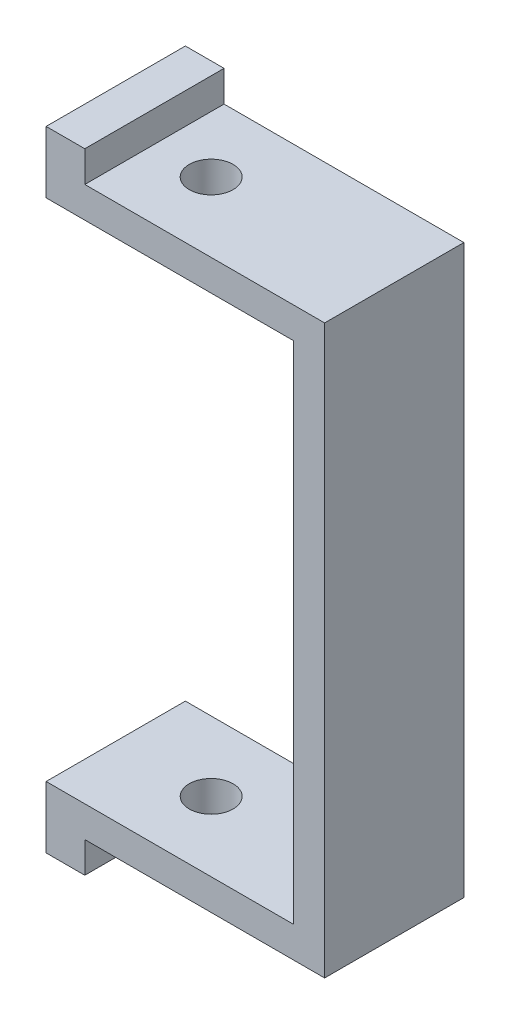
ISO-10303-21;
HEADER;
FILE_DESCRIPTION(('STEP AP214'),'2;1');
FILE_NAME('part.step','',(''),(''),'','','');
FILE_SCHEMA(('AUTOMOTIVE_DESIGN { 1 0 10303 214 1 1 1 1 }'));
ENDSEC;
DATA;
#1=APPLICATION_CONTEXT('core data for automotive mechanical design processes');
#2=APPLICATION_PROTOCOL_DEFINITION('international standard','automotive_design',2000,#1);
#3=PRODUCT_CONTEXT('',#1,'mechanical');
#4=PRODUCT('Part','Part','',(#3));
#5=PRODUCT_RELATED_PRODUCT_CATEGORY('part','',(#4));
#6=PRODUCT_DEFINITION_FORMATION('','',#4);
#7=PRODUCT_DEFINITION_CONTEXT('part definition',#1,'design');
#8=PRODUCT_DEFINITION('design','',#6,#7);
#9=PRODUCT_DEFINITION_SHAPE('','',#8);
#10=(LENGTH_UNIT() NAMED_UNIT(*) SI_UNIT(.MILLI.,.METRE.));
#11=(NAMED_UNIT(*) PLANE_ANGLE_UNIT() SI_UNIT($,.RADIAN.));
#12=(NAMED_UNIT(*) SI_UNIT($,.STERADIAN.) SOLID_ANGLE_UNIT());
#13=UNCERTAINTY_MEASURE_WITH_UNIT(LENGTH_MEASURE(1.E-05),#10,'distance_accuracy_value','');
#14=(GEOMETRIC_REPRESENTATION_CONTEXT(3) GLOBAL_UNCERTAINTY_ASSIGNED_CONTEXT((#13)) GLOBAL_UNIT_ASSIGNED_CONTEXT((#10,
#11,#12)) REPRESENTATION_CONTEXT('',''));
#15=CARTESIAN_POINT('',(0.,0.,0.));
#16=DIRECTION('',(0.,0.,1.));
#17=DIRECTION('',(1.,0.,0.));
#18=AXIS2_PLACEMENT_3D('',#15,#16,#17);
#19=CARTESIAN_POINT('',(0.,-3.,13.5));
#20=DIRECTION('',(0.,1.,0.));
#21=DIRECTION('',(0.,0.,1.));
#22=AXIS2_PLACEMENT_3D('',#19,#20,#21);
#23=PLANE('',#22);
#24=DIRECTION('',(1.,0.,0.));
#25=VECTOR('',#24,1.);
#26=CARTESIAN_POINT('',(0.,-3.,0.));
#27=LINE('',#26,#25);
#28=CARTESIAN_POINT('',(0.,-3.,0.));
#29=VERTEX_POINT('',#28);
#30=CARTESIAN_POINT('',(3.75,-3.,0.));
#31=VERTEX_POINT('',#30);
#32=EDGE_CURVE('E161',#29,#31,#27,.T.);
#33=ORIENTED_EDGE('',*,*,#32,.T.);
#34=DIRECTION('',(0.,0.,-1.));
#35=VECTOR('',#34,1.);
#36=CARTESIAN_POINT('',(3.75,-3.,13.5));
#37=LINE('',#36,#35);
#38=CARTESIAN_POINT('',(3.75,-3.,13.5));
#39=VERTEX_POINT('',#38);
#40=EDGE_CURVE('E45',#39,#31,#37,.T.);
#41=ORIENTED_EDGE('',*,*,#40,.F.);
#42=DIRECTION('',(1.,0.,0.));
#43=VECTOR('',#42,1.);
#44=CARTESIAN_POINT('',(0.,-3.,13.5));
#45=LINE('',#44,#43);
#46=CARTESIAN_POINT('',(0.,-3.,13.5));
#47=VERTEX_POINT('',#46);
#48=EDGE_CURVE('E109',#47,#39,#45,.T.);
#49=ORIENTED_EDGE('',*,*,#48,.F.);
#50=DIRECTION('',(0.,0.,-1.));
#51=VECTOR('',#50,1.);
#52=CARTESIAN_POINT('',(0.,-3.,13.5));
#53=LINE('',#52,#51);
#54=EDGE_CURVE('E11',#47,#29,#53,.T.);
#55=ORIENTED_EDGE('',*,*,#54,.T.);
#56=EDGE_LOOP('',(#33,#41,#49,#55));
#57=FACE_BOUND('',#56,.T.);
#58=ADVANCED_FACE('F36',(#57),#23,.F.);
#59=CARTESIAN_POINT('',(3.75,0.,13.5));
#60=DIRECTION('',(-1.,0.,0.));
#61=DIRECTION('',(0.,-1.,0.));
#62=AXIS2_PLACEMENT_3D('',#59,#60,#61);
#63=PLANE('',#62);
#64=DIRECTION('',(0.,1.,0.));
#65=VECTOR('',#64,1.);
#66=CARTESIAN_POINT('',(3.75,0.,0.));
#67=LINE('',#66,#65);
#68=CARTESIAN_POINT('',(3.75,0.,0.));
#69=VERTEX_POINT('',#68);
#70=EDGE_CURVE('E163',#31,#69,#67,.T.);
#71=ORIENTED_EDGE('',*,*,#70,.T.);
#72=DIRECTION('',(0.,0.,-1.));
#73=VECTOR('',#72,1.);
#74=CARTESIAN_POINT('',(3.75,0.,13.5));
#75=LINE('',#74,#73);
#76=CARTESIAN_POINT('',(3.75,0.,13.5));
#77=VERTEX_POINT('',#76);
#78=EDGE_CURVE('E202',#77,#69,#75,.T.);
#79=ORIENTED_EDGE('',*,*,#78,.F.);
#80=DIRECTION('',(0.,1.,0.));
#81=VECTOR('',#80,1.);
#82=CARTESIAN_POINT('',(3.75,0.,13.5));
#83=LINE('',#82,#81);
#84=EDGE_CURVE('E211',#39,#77,#83,.T.);
#85=ORIENTED_EDGE('',*,*,#84,.F.);
#86=ORIENTED_EDGE('',*,*,#40,.T.);
#87=EDGE_LOOP('',(#71,#79,#85,#86));
#88=FACE_BOUND('',#87,.T.);
#89=ADVANCED_FACE('F209',(#88),#63,.F.);
#90=CARTESIAN_POINT('',(3.75,0.,13.5));
#91=DIRECTION('',(0.,1.,0.));
#92=DIRECTION('',(0.,0.,1.));
#93=AXIS2_PLACEMENT_3D('',#90,#91,#92);
#94=PLANE('',#93);
#95=CARTESIAN_POINT('',(9.25,0.,6.75));
#96=DIRECTION('',(0.,-1.,0.));
#97=DIRECTION('',(0.,0.,-1.));
#98=AXIS2_PLACEMENT_3D('',#95,#96,#97);
#99=CIRCLE('',#98,2.125);
#100=CARTESIAN_POINT('',(9.25,0.,4.625));
#101=VERTEX_POINT('',#100);
#102=EDGE_CURVE('E258',#101,#101,#99,.T.);
#103=ORIENTED_EDGE('',*,*,#102,.F.);
#104=EDGE_LOOP('',(#103));
#105=FACE_BOUND('',#104,.T.);
#106=DIRECTION('',(1.,0.,0.));
#107=VECTOR('',#106,1.);
#108=CARTESIAN_POINT('',(3.75,0.,0.));
#109=LINE('',#108,#107);
#110=CARTESIAN_POINT('',(27.,0.,0.));
#111=VERTEX_POINT('',#110);
#112=EDGE_CURVE('E166',#69,#111,#109,.T.);
#113=ORIENTED_EDGE('',*,*,#112,.T.);
#114=DIRECTION('',(0.,0.,-1.));
#115=VECTOR('',#114,1.);
#116=CARTESIAN_POINT('',(27.,0.,13.5));
#117=LINE('',#116,#115);
#118=CARTESIAN_POINT('',(27.,0.,13.5));
#119=VERTEX_POINT('',#118);
#120=EDGE_CURVE('E199',#119,#111,#117,.T.);
#121=ORIENTED_EDGE('',*,*,#120,.F.);
#122=DIRECTION('',(1.,0.,0.));
#123=VECTOR('',#122,1.);
#124=CARTESIAN_POINT('',(3.75,0.,13.5));
#125=LINE('',#124,#123);
#126=EDGE_CURVE('E230',#77,#119,#125,.T.);
#127=ORIENTED_EDGE('',*,*,#126,.F.);
#128=ORIENTED_EDGE('',*,*,#78,.T.);
#129=EDGE_LOOP('',(#113,#121,#127,#128));
#130=FACE_BOUND('',#129,.T.);
#131=ADVANCED_FACE('F221',(#105,#130),#94,.F.);
#132=CARTESIAN_POINT('',(27.,0.,13.5));
#133=DIRECTION('',(-1.,0.,0.));
#134=DIRECTION('',(0.,0.,1.));
#135=AXIS2_PLACEMENT_3D('',#132,#133,#134);
#136=PLANE('',#135);
#137=DIRECTION('',(0.,1.,0.));
#138=VECTOR('',#137,1.);
#139=CARTESIAN_POINT('',(27.,0.,0.));
#140=LINE('',#139,#138);
#141=CARTESIAN_POINT('',(27.,55.,0.));
#142=VERTEX_POINT('',#141);
#143=EDGE_CURVE('E168',#111,#142,#140,.T.);
#144=ORIENTED_EDGE('',*,*,#143,.T.);
#145=DIRECTION('',(0.,0.,-1.));
#146=VECTOR('',#145,1.);
#147=CARTESIAN_POINT('',(27.,55.,13.5));
#148=LINE('',#147,#146);
#149=CARTESIAN_POINT('',(27.,55.,13.5));
#150=VERTEX_POINT('',#149);
#151=EDGE_CURVE('E196',#150,#142,#148,.T.);
#152=ORIENTED_EDGE('',*,*,#151,.F.);
#153=DIRECTION('',(0.,1.,0.));
#154=VECTOR('',#153,1.);
#155=CARTESIAN_POINT('',(27.,0.,13.5));
#156=LINE('',#155,#154);
#157=EDGE_CURVE('E227',#119,#150,#156,.T.);
#158=ORIENTED_EDGE('',*,*,#157,.F.);
#159=ORIENTED_EDGE('',*,*,#120,.T.);
#160=EDGE_LOOP('',(#144,#152,#158,#159));
#161=FACE_BOUND('',#160,.T.);
#162=ADVANCED_FACE('F225',(#161),#136,.F.);
#163=CARTESIAN_POINT('',(27.,55.,13.5));
#164=DIRECTION('',(0.,-1.,0.));
#165=DIRECTION('',(0.,0.,-1.));
#166=AXIS2_PLACEMENT_3D('',#163,#164,#165);
#167=PLANE('',#166);
#168=CARTESIAN_POINT('',(9.25,55.,6.75));
#169=DIRECTION('',(0.,-1.,0.));
#170=DIRECTION('',(0.,0.,-1.));
#171=AXIS2_PLACEMENT_3D('',#168,#169,#170);
#172=CIRCLE('',#171,2.125);
#173=CARTESIAN_POINT('',(9.25,55.,4.625));
#174=VERTEX_POINT('',#173);
#175=EDGE_CURVE('E164',#174,#174,#172,.T.);
#176=ORIENTED_EDGE('',*,*,#175,.T.);
#177=EDGE_LOOP('',(#176));
#178=FACE_BOUND('',#177,.T.);
#179=DIRECTION('',(-1.,0.,0.));
#180=VECTOR('',#179,1.);
#181=CARTESIAN_POINT('',(27.,55.,0.));
#182=LINE('',#181,#180);
#183=CARTESIAN_POINT('',(3.74999999999998,55.,0.));
#184=VERTEX_POINT('',#183);
#185=EDGE_CURVE('E170',#142,#184,#182,.T.);
#186=ORIENTED_EDGE('',*,*,#185,.T.);
#187=DIRECTION('',(0.,0.,-1.));
#188=VECTOR('',#187,1.);
#189=CARTESIAN_POINT('',(3.74999999999998,55.,13.5));
#190=LINE('',#189,#188);
#191=CARTESIAN_POINT('',(3.74999999999998,55.,13.5));
#192=VERTEX_POINT('',#191);
#193=EDGE_CURVE('E193',#192,#184,#190,.T.);
#194=ORIENTED_EDGE('',*,*,#193,.F.);
#195=DIRECTION('',(-1.,0.,0.));
#196=VECTOR('',#195,1.);
#197=CARTESIAN_POINT('',(27.,55.,13.5));
#198=LINE('',#197,#196);
#199=EDGE_CURVE('E229',#150,#192,#198,.T.);
#200=ORIENTED_EDGE('',*,*,#199,.F.);
#201=ORIENTED_EDGE('',*,*,#151,.T.);
#202=EDGE_LOOP('',(#186,#194,#200,#201));
#203=FACE_BOUND('',#202,.T.);
#204=ADVANCED_FACE('F289',(#178,#203),#167,.F.);
#205=CARTESIAN_POINT('',(3.74999999999998,55.,13.5));
#206=DIRECTION('',(-1.,0.,0.));
#207=DIRECTION('',(0.,-1.,0.));
#208=AXIS2_PLACEMENT_3D('',#205,#206,#207);
#209=PLANE('',#208);
#210=DIRECTION('',(0.,1.,0.));
#211=VECTOR('',#210,1.);
#212=CARTESIAN_POINT('',(3.74999999999998,55.,0.));
#213=LINE('',#212,#211);
#214=CARTESIAN_POINT('',(3.74999999999998,58.,0.));
#215=VERTEX_POINT('',#214);
#216=EDGE_CURVE('E172',#184,#215,#213,.T.);
#217=ORIENTED_EDGE('',*,*,#216,.T.);
#218=DIRECTION('',(0.,0.,-1.));
#219=VECTOR('',#218,1.);
#220=CARTESIAN_POINT('',(3.74999999999998,58.,13.5));
#221=LINE('',#220,#219);
#222=CARTESIAN_POINT('',(3.74999999999998,58.,13.5));
#223=VERTEX_POINT('',#222);
#224=EDGE_CURVE('E190',#223,#215,#221,.T.);
#225=ORIENTED_EDGE('',*,*,#224,.F.);
#226=DIRECTION('',(0.,1.,0.));
#227=VECTOR('',#226,1.);
#228=CARTESIAN_POINT('',(3.74999999999998,55.,13.5));
#229=LINE('',#228,#227);
#230=EDGE_CURVE('E232',#192,#223,#229,.T.);
#231=ORIENTED_EDGE('',*,*,#230,.F.);
#232=ORIENTED_EDGE('',*,*,#193,.T.);
#233=EDGE_LOOP('',(#217,#225,#231,#232));
#234=FACE_BOUND('',#233,.T.);
#235=ADVANCED_FACE('F292',(#234),#209,.F.);
#236=CARTESIAN_POINT('',(0.,58.,13.5));
#237=DIRECTION('',(0.,-1.,0.));
#238=DIRECTION('',(0.,0.,-1.));
#239=AXIS2_PLACEMENT_3D('',#236,#237,#238);
#240=PLANE('',#239);
#241=DIRECTION('',(-1.,0.,0.));
#242=VECTOR('',#241,1.);
#243=CARTESIAN_POINT('',(0.,58.,0.));
#244=LINE('',#243,#242);
#245=CARTESIAN_POINT('',(0.,58.,0.));
#246=VERTEX_POINT('',#245);
#247=EDGE_CURVE('E174',#215,#246,#244,.T.);
#248=ORIENTED_EDGE('',*,*,#247,.T.);
#249=DIRECTION('',(0.,0.,-1.));
#250=VECTOR('',#249,1.);
#251=CARTESIAN_POINT('',(0.,58.,13.5));
#252=LINE('',#251,#250);
#253=CARTESIAN_POINT('',(0.,58.,13.5));
#254=VERTEX_POINT('',#253);
#255=EDGE_CURVE('E187',#254,#246,#252,.T.);
#256=ORIENTED_EDGE('',*,*,#255,.F.);
#257=DIRECTION('',(-1.,0.,0.));
#258=VECTOR('',#257,1.);
#259=CARTESIAN_POINT('',(0.,58.,13.5));
#260=LINE('',#259,#258);
#261=EDGE_CURVE('E238',#223,#254,#260,.T.);
#262=ORIENTED_EDGE('',*,*,#261,.F.);
#263=ORIENTED_EDGE('',*,*,#224,.T.);
#264=EDGE_LOOP('',(#248,#256,#262,#263));
#265=FACE_BOUND('',#264,.T.);
#266=ADVANCED_FACE('F244',(#265),#240,.F.);
#267=CARTESIAN_POINT('',(0.,55.,13.5));
#268=DIRECTION('',(1.,0.,0.));
#269=DIRECTION('',(0.,1.,0.));
#270=AXIS2_PLACEMENT_3D('',#267,#268,#269);
#271=PLANE('',#270);
#272=DIRECTION('',(0.,-1.,0.));
#273=VECTOR('',#272,1.);
#274=CARTESIAN_POINT('',(0.,55.,0.));
#275=LINE('',#274,#273);
#276=CARTESIAN_POINT('',(0.,52.,0.));
#277=VERTEX_POINT('',#276);
#278=EDGE_CURVE('E177',#246,#277,#275,.T.);
#279=ORIENTED_EDGE('',*,*,#278,.T.);
#280=DIRECTION('',(0.,0.,-1.));
#281=VECTOR('',#280,1.);
#282=CARTESIAN_POINT('',(0.,52.,13.5));
#283=LINE('',#282,#281);
#284=CARTESIAN_POINT('',(0.,52.,13.5));
#285=VERTEX_POINT('',#284);
#286=EDGE_CURVE('E150',#285,#277,#283,.T.);
#287=ORIENTED_EDGE('',*,*,#286,.F.);
#288=DIRECTION('',(0.,-1.,0.));
#289=VECTOR('',#288,1.);
#290=CARTESIAN_POINT('',(0.,55.,13.5));
#291=LINE('',#290,#289);
#292=EDGE_CURVE('E141',#254,#285,#291,.T.);
#293=ORIENTED_EDGE('',*,*,#292,.F.);
#294=ORIENTED_EDGE('',*,*,#255,.T.);
#295=EDGE_LOOP('',(#279,#287,#293,#294));
#296=FACE_BOUND('',#295,.T.);
#297=ADVANCED_FACE('F247',(#296),#271,.F.);
#298=CARTESIAN_POINT('',(24.,52.,13.5));
#299=DIRECTION('',(0.,1.,0.));
#300=DIRECTION('',(0.,0.,1.));
#301=AXIS2_PLACEMENT_3D('',#298,#299,#300);
#302=PLANE('',#301);
#303=CARTESIAN_POINT('',(9.25,52.,6.75));
#304=DIRECTION('',(0.,1.,0.));
#305=DIRECTION('',(0.,0.,1.));
#306=AXIS2_PLACEMENT_3D('',#303,#304,#305);
#307=CIRCLE('',#306,2.125);
#308=CARTESIAN_POINT('',(9.25,52.,8.875));
#309=VERTEX_POINT('',#308);
#310=EDGE_CURVE('E255',#309,#309,#307,.T.);
#311=ORIENTED_EDGE('',*,*,#310,.T.);
#312=EDGE_LOOP('',(#311));
#313=FACE_BOUND('',#312,.T.);
#314=DIRECTION('',(1.,0.,0.));
#315=VECTOR('',#314,1.);
#316=CARTESIAN_POINT('',(24.,52.,0.));
#317=LINE('',#316,#315);
#318=CARTESIAN_POINT('',(24.,52.,0.));
#319=VERTEX_POINT('',#318);
#320=EDGE_CURVE('E149',#277,#319,#317,.T.);
#321=ORIENTED_EDGE('',*,*,#320,.T.);
#322=DIRECTION('',(0.,0.,-1.));
#323=VECTOR('',#322,1.);
#324=CARTESIAN_POINT('',(24.,52.,13.5));
#325=LINE('',#324,#323);
#326=CARTESIAN_POINT('',(24.,52.,13.5));
#327=VERTEX_POINT('',#326);
#328=EDGE_CURVE('E146',#327,#319,#325,.T.);
#329=ORIENTED_EDGE('',*,*,#328,.F.);
#330=DIRECTION('',(1.,0.,0.));
#331=VECTOR('',#330,1.);
#332=CARTESIAN_POINT('',(24.,52.,13.5));
#333=LINE('',#332,#331);
#334=EDGE_CURVE('E135',#285,#327,#333,.T.);
#335=ORIENTED_EDGE('',*,*,#334,.F.);
#336=ORIENTED_EDGE('',*,*,#286,.T.);
#337=EDGE_LOOP('',(#321,#329,#335,#336));
#338=FACE_BOUND('',#337,.T.);
#339=ADVANCED_FACE('F147',(#313,#338),#302,.F.);
#340=CARTESIAN_POINT('',(24.,3.,13.5));
#341=DIRECTION('',(1.,0.,0.));
#342=DIRECTION('',(0.,0.,-1.));
#343=AXIS2_PLACEMENT_3D('',#340,#341,#342);
#344=PLANE('',#343);
#345=DIRECTION('',(0.,-1.,0.));
#346=VECTOR('',#345,1.);
#347=CARTESIAN_POINT('',(24.,3.,0.));
#348=LINE('',#347,#346);
#349=CARTESIAN_POINT('',(24.,3.,0.));
#350=VERTEX_POINT('',#349);
#351=EDGE_CURVE('E95',#319,#350,#348,.T.);
#352=ORIENTED_EDGE('',*,*,#351,.T.);
#353=DIRECTION('',(0.,0.,-1.));
#354=VECTOR('',#353,1.);
#355=CARTESIAN_POINT('',(24.,3.,13.5));
#356=LINE('',#355,#354);
#357=CARTESIAN_POINT('',(24.,3.,13.5));
#358=VERTEX_POINT('',#357);
#359=EDGE_CURVE('E151',#358,#350,#356,.T.);
#360=ORIENTED_EDGE('',*,*,#359,.F.);
#361=DIRECTION('',(0.,-1.,0.));
#362=VECTOR('',#361,1.);
#363=CARTESIAN_POINT('',(24.,3.,13.5));
#364=LINE('',#363,#362);
#365=EDGE_CURVE('E139',#327,#358,#364,.T.);
#366=ORIENTED_EDGE('',*,*,#365,.F.);
#367=ORIENTED_EDGE('',*,*,#328,.T.);
#368=EDGE_LOOP('',(#352,#360,#366,#367));
#369=FACE_BOUND('',#368,.T.);
#370=ADVANCED_FACE('F153',(#369),#344,.F.);
#371=CARTESIAN_POINT('',(0.,3.,13.5));
#372=DIRECTION('',(0.,-1.,0.));
#373=DIRECTION('',(0.,0.,-1.));
#374=AXIS2_PLACEMENT_3D('',#371,#372,#373);
#375=PLANE('',#374);
#376=CARTESIAN_POINT('',(9.25,3.,6.75));
#377=DIRECTION('',(0.,-1.,0.));
#378=DIRECTION('',(0.,0.,-1.));
#379=AXIS2_PLACEMENT_3D('',#376,#377,#378);
#380=CIRCLE('',#379,2.125);
#381=CARTESIAN_POINT('',(9.25,3.,4.625));
#382=VERTEX_POINT('',#381);
#383=EDGE_CURVE('E39',#382,#382,#380,.T.);
#384=ORIENTED_EDGE('',*,*,#383,.T.);
#385=EDGE_LOOP('',(#384));
#386=FACE_BOUND('',#385,.T.);
#387=DIRECTION('',(-1.,0.,0.));
#388=VECTOR('',#387,1.);
#389=CARTESIAN_POINT('',(0.,3.,0.));
#390=LINE('',#389,#388);
#391=CARTESIAN_POINT('',(0.,3.,0.));
#392=VERTEX_POINT('',#391);
#393=EDGE_CURVE('E102',#350,#392,#390,.T.);
#394=ORIENTED_EDGE('',*,*,#393,.T.);
#395=DIRECTION('',(0.,0.,-1.));
#396=VECTOR('',#395,1.);
#397=CARTESIAN_POINT('',(0.,3.,13.5));
#398=LINE('',#397,#396);
#399=CARTESIAN_POINT('',(0.,3.,13.5));
#400=VERTEX_POINT('',#399);
#401=EDGE_CURVE('E157',#400,#392,#398,.T.);
#402=ORIENTED_EDGE('',*,*,#401,.F.);
#403=DIRECTION('',(-1.,0.,0.));
#404=VECTOR('',#403,1.);
#405=CARTESIAN_POINT('',(0.,3.,13.5));
#406=LINE('',#405,#404);
#407=EDGE_CURVE('E155',#358,#400,#406,.T.);
#408=ORIENTED_EDGE('',*,*,#407,.F.);
#409=ORIENTED_EDGE('',*,*,#359,.T.);
#410=EDGE_LOOP('',(#394,#402,#408,#409));
#411=FACE_BOUND('',#410,.T.);
#412=ADVANCED_FACE('F249',(#386,#411),#375,.F.);
#413=CARTESIAN_POINT('',(0.,3.,13.5));
#414=DIRECTION('',(1.,0.,0.));
#415=DIRECTION('',(0.,0.,-1.));
#416=AXIS2_PLACEMENT_3D('',#413,#414,#415);
#417=PLANE('',#416);
#418=DIRECTION('',(0.,-1.,0.));
#419=VECTOR('',#418,1.);
#420=CARTESIAN_POINT('',(0.,3.,0.));
#421=LINE('',#420,#419);
#422=EDGE_CURVE('E182',#392,#29,#421,.T.);
#423=ORIENTED_EDGE('',*,*,#422,.T.);
#424=ORIENTED_EDGE('',*,*,#54,.F.);
#425=DIRECTION('',(0.,-1.,0.));
#426=VECTOR('',#425,1.);
#427=CARTESIAN_POINT('',(0.,0.,13.5));
#428=LINE('',#427,#426);
#429=EDGE_CURVE('E53',#400,#47,#428,.T.);
#430=ORIENTED_EDGE('',*,*,#429,.F.);
#431=ORIENTED_EDGE('',*,*,#401,.T.);
#432=EDGE_LOOP('',(#423,#424,#430,#431));
#433=FACE_BOUND('',#432,.T.);
#434=ADVANCED_FACE('F248',(#433),#417,.F.);
#435=CARTESIAN_POINT('',(0.,0.,13.5));
#436=DIRECTION('',(0.,0.,1.));
#437=DIRECTION('',(1.,0.,0.));
#438=AXIS2_PLACEMENT_3D('',#435,#436,#437);
#439=PLANE('',#438);
#440=ORIENTED_EDGE('',*,*,#429,.T.);
#441=ORIENTED_EDGE('',*,*,#48,.T.);
#442=ORIENTED_EDGE('',*,*,#84,.T.);
#443=ORIENTED_EDGE('',*,*,#126,.T.);
#444=ORIENTED_EDGE('',*,*,#157,.T.);
#445=ORIENTED_EDGE('',*,*,#199,.T.);
#446=ORIENTED_EDGE('',*,*,#230,.T.);
#447=ORIENTED_EDGE('',*,*,#261,.T.);
#448=ORIENTED_EDGE('',*,*,#292,.T.);
#449=ORIENTED_EDGE('',*,*,#334,.T.);
#450=ORIENTED_EDGE('',*,*,#365,.T.);
#451=ORIENTED_EDGE('',*,*,#407,.T.);
#452=EDGE_LOOP('',(#440,#441,#442,#443,#444,#445,#446,#447,#448,#449,#450,#451));
#453=FACE_BOUND('',#452,.T.);
#454=ADVANCED_FACE('F137',(#453),#439,.T.);
#455=CARTESIAN_POINT('',(0.,0.,0.));
#456=DIRECTION('',(0.,0.,1.));
#457=DIRECTION('',(1.,0.,0.));
#458=AXIS2_PLACEMENT_3D('',#455,#456,#457);
#459=PLANE('',#458);
#460=ORIENTED_EDGE('',*,*,#32,.F.);
#461=ORIENTED_EDGE('',*,*,#422,.F.);
#462=ORIENTED_EDGE('',*,*,#393,.F.);
#463=ORIENTED_EDGE('',*,*,#351,.F.);
#464=ORIENTED_EDGE('',*,*,#320,.F.);
#465=ORIENTED_EDGE('',*,*,#278,.F.);
#466=ORIENTED_EDGE('',*,*,#247,.F.);
#467=ORIENTED_EDGE('',*,*,#216,.F.);
#468=ORIENTED_EDGE('',*,*,#185,.F.);
#469=ORIENTED_EDGE('',*,*,#143,.F.);
#470=ORIENTED_EDGE('',*,*,#112,.F.);
#471=ORIENTED_EDGE('',*,*,#70,.F.);
#472=EDGE_LOOP('',(#460,#461,#462,#463,#464,#465,#466,#467,#468,#469,#470,#471));
#473=FACE_BOUND('',#472,.T.);
#474=ADVANCED_FACE('F215',(#473),#459,.F.);
#475=CARTESIAN_POINT('',(9.25,76.,6.75));
#476=DIRECTION('',(0.,-1.,0.));
#477=DIRECTION('',(0.,0.,-1.));
#478=AXIS2_PLACEMENT_3D('',#475,#476,#477);
#479=CYLINDRICAL_SURFACE('',#478,2.125);
#480=ORIENTED_EDGE('',*,*,#102,.T.);
#481=EDGE_LOOP('',(#480));
#482=FACE_BOUND('',#481,.T.);
#483=ORIENTED_EDGE('',*,*,#383,.F.);
#484=EDGE_LOOP('',(#483));
#485=FACE_BOUND('',#484,.T.);
#486=ADVANCED_FACE('F266',(#482,#485),#479,.F.);
#487=ORIENTED_EDGE('',*,*,#310,.F.);
#488=EDGE_LOOP('',(#487));
#489=FACE_BOUND('',#488,.T.);
#490=ORIENTED_EDGE('',*,*,#175,.F.);
#491=EDGE_LOOP('',(#490));
#492=FACE_BOUND('',#491,.T.);
#493=ADVANCED_FACE('F268',(#489,#492),#479,.F.);
#494=CLOSED_SHELL('',(#58,#89,#131,#162,#204,#235,#266,#297,#339,#370,#412,#434,#454,#474,#486,#493));
#495=MANIFOLD_SOLID_BREP('B2',#494);
#496=ADVANCED_BREP_SHAPE_REPRESENTATION('',(#18,#495),#14);
#497=SHAPE_DEFINITION_REPRESENTATION(#9,#496);
ENDSEC;
END-ISO-10303-21;
